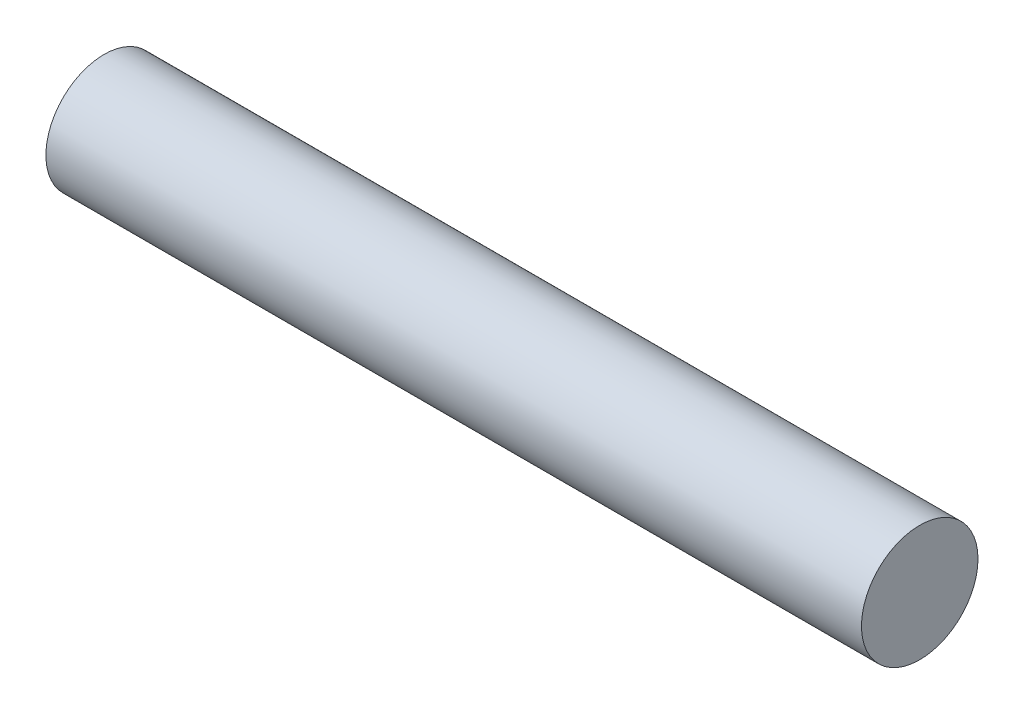
ISO-10303-21;
HEADER;
FILE_DESCRIPTION(('STEP AP214'),'2;1');
FILE_NAME('part.step','',(''),(''),'','','');
FILE_SCHEMA(('AUTOMOTIVE_DESIGN { 1 0 10303 214 1 1 1 1 }'));
ENDSEC;
DATA;
#1=APPLICATION_CONTEXT('core data for automotive mechanical design processes');
#2=APPLICATION_PROTOCOL_DEFINITION('international standard','automotive_design',2000,#1);
#3=PRODUCT_CONTEXT('',#1,'mechanical');
#4=PRODUCT('Part','Part','',(#3));
#5=PRODUCT_RELATED_PRODUCT_CATEGORY('part','',(#4));
#6=PRODUCT_DEFINITION_FORMATION('','',#4);
#7=PRODUCT_DEFINITION_CONTEXT('part definition',#1,'design');
#8=PRODUCT_DEFINITION('design','',#6,#7);
#9=PRODUCT_DEFINITION_SHAPE('','',#8);
#10=(LENGTH_UNIT() NAMED_UNIT(*) SI_UNIT(.MILLI.,.METRE.));
#11=(NAMED_UNIT(*) PLANE_ANGLE_UNIT() SI_UNIT($,.RADIAN.));
#12=(NAMED_UNIT(*) SI_UNIT($,.STERADIAN.) SOLID_ANGLE_UNIT());
#13=UNCERTAINTY_MEASURE_WITH_UNIT(LENGTH_MEASURE(1.E-05),#10,'distance_accuracy_value','');
#14=(GEOMETRIC_REPRESENTATION_CONTEXT(3) GLOBAL_UNCERTAINTY_ASSIGNED_CONTEXT((#13)) GLOBAL_UNIT_ASSIGNED_CONTEXT((#10,
#11,#12)) REPRESENTATION_CONTEXT('',''));
#15=CARTESIAN_POINT('',(0.,0.,0.));
#16=DIRECTION('',(0.,0.,1.));
#17=DIRECTION('',(1.,0.,0.));
#18=AXIS2_PLACEMENT_3D('',#15,#16,#17);
#19=CARTESIAN_POINT('',(14.,0.,0.));
#20=DIRECTION('',(-1.,0.,0.));
#21=DIRECTION('',(0.,0.,1.));
#22=AXIS2_PLACEMENT_3D('',#19,#20,#21);
#23=CYLINDRICAL_SURFACE('',#22,1.);
#24=CARTESIAN_POINT('',(14.,0.,0.));
#25=DIRECTION('',(1.,0.,0.));
#26=DIRECTION('',(0.,0.,-1.));
#27=AXIS2_PLACEMENT_3D('',#24,#25,#26);
#28=CIRCLE('',#27,1.);
#29=CARTESIAN_POINT('',(14.,0.,-1.));
#30=VERTEX_POINT('',#29);
#31=EDGE_CURVE('E10',#30,#30,#28,.T.);
#32=ORIENTED_EDGE('',*,*,#31,.F.);
#33=EDGE_LOOP('',(#32));
#34=FACE_BOUND('',#33,.T.);
#35=CARTESIAN_POINT('',(0.,0.,0.));
#36=DIRECTION('',(1.,0.,0.));
#37=DIRECTION('',(0.,0.,-1.));
#38=AXIS2_PLACEMENT_3D('',#35,#36,#37);
#39=CIRCLE('',#38,1.);
#40=CARTESIAN_POINT('',(0.,0.,-1.));
#41=VERTEX_POINT('',#40);
#42=EDGE_CURVE('E44',#41,#41,#39,.T.);
#43=ORIENTED_EDGE('',*,*,#42,.T.);
#44=EDGE_LOOP('',(#43));
#45=FACE_BOUND('',#44,.T.);
#46=ADVANCED_FACE('F41',(#34,#45),#23,.T.);
#47=CARTESIAN_POINT('',(14.,0.,0.));
#48=DIRECTION('',(1.,0.,0.));
#49=DIRECTION('',(0.,0.,-1.));
#50=AXIS2_PLACEMENT_3D('',#47,#48,#49);
#51=PLANE('',#50);
#52=ORIENTED_EDGE('',*,*,#31,.T.);
#53=EDGE_LOOP('',(#52));
#54=FACE_BOUND('',#53,.T.);
#55=ADVANCED_FACE('F56',(#54),#51,.T.);
#56=CARTESIAN_POINT('',(0.,0.,0.));
#57=DIRECTION('',(1.,0.,0.));
#58=DIRECTION('',(0.,0.,-1.));
#59=AXIS2_PLACEMENT_3D('',#56,#57,#58);
#60=PLANE('',#59);
#61=ORIENTED_EDGE('',*,*,#42,.F.);
#62=EDGE_LOOP('',(#61));
#63=FACE_BOUND('',#62,.T.);
#64=ADVANCED_FACE('F54',(#63),#60,.F.);
#65=CLOSED_SHELL('',(#46,#55,#64));
#66=MANIFOLD_SOLID_BREP('B2',#65);
#67=ADVANCED_BREP_SHAPE_REPRESENTATION('',(#18,#66),#14);
#68=SHAPE_DEFINITION_REPRESENTATION(#9,#67);
ENDSEC;
END-ISO-10303-21;
